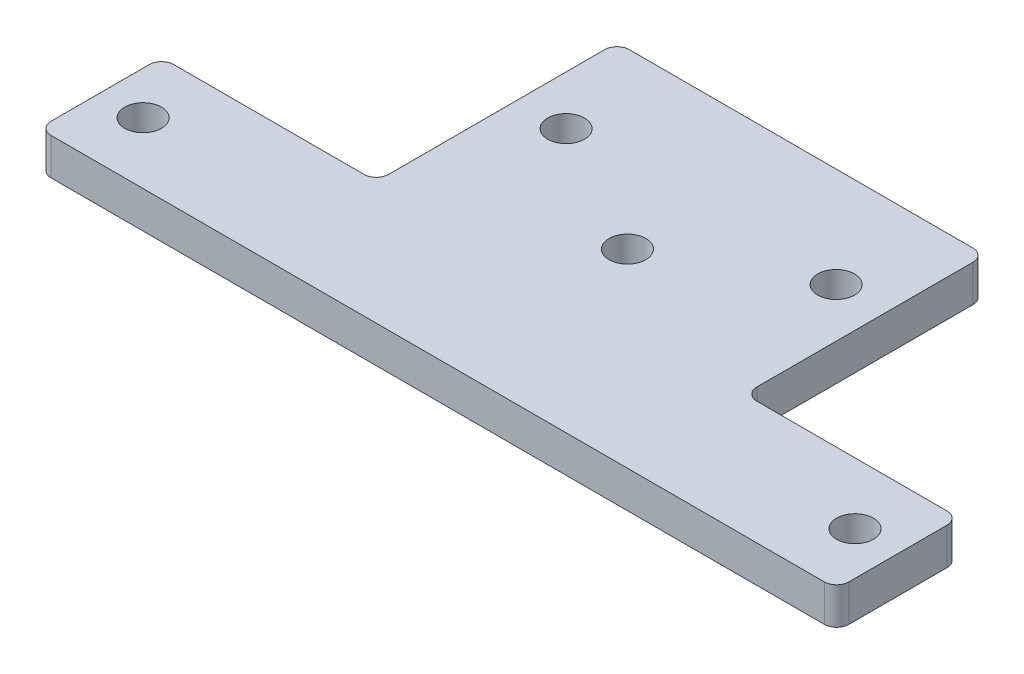
ISO-10303-21;
HEADER;
FILE_DESCRIPTION(('STEP AP214'),'2;1');
FILE_NAME('part.step','',(''),(''),'','','');
FILE_SCHEMA(('AUTOMOTIVE_DESIGN { 1 0 10303 214 1 1 1 1 }'));
ENDSEC;
DATA;
#1=APPLICATION_CONTEXT('core data for automotive mechanical design processes');
#2=APPLICATION_PROTOCOL_DEFINITION('international standard','automotive_design',2000,#1);
#3=PRODUCT_CONTEXT('',#1,'mechanical');
#4=PRODUCT('Part','Part','',(#3));
#5=PRODUCT_RELATED_PRODUCT_CATEGORY('part','',(#4));
#6=PRODUCT_DEFINITION_FORMATION('','',#4);
#7=PRODUCT_DEFINITION_CONTEXT('part definition',#1,'design');
#8=PRODUCT_DEFINITION('design','',#6,#7);
#9=PRODUCT_DEFINITION_SHAPE('','',#8);
#10=(LENGTH_UNIT() NAMED_UNIT(*) SI_UNIT(.MILLI.,.METRE.));
#11=(NAMED_UNIT(*) PLANE_ANGLE_UNIT() SI_UNIT($,.RADIAN.));
#12=(NAMED_UNIT(*) SI_UNIT($,.STERADIAN.) SOLID_ANGLE_UNIT());
#13=UNCERTAINTY_MEASURE_WITH_UNIT(LENGTH_MEASURE(1.E-05),#10,'distance_accuracy_value','');
#14=(GEOMETRIC_REPRESENTATION_CONTEXT(3) GLOBAL_UNCERTAINTY_ASSIGNED_CONTEXT((#13)) GLOBAL_UNIT_ASSIGNED_CONTEXT((#10,
#11,#12)) REPRESENTATION_CONTEXT('',''));
#15=CARTESIAN_POINT('',(0.,0.,0.));
#16=DIRECTION('',(0.,0.,1.));
#17=DIRECTION('',(1.,0.,0.));
#18=AXIS2_PLACEMENT_3D('',#15,#16,#17);
#19=CARTESIAN_POINT('',(0.,3.,0.));
#20=DIRECTION('',(0.,1.,0.));
#21=DIRECTION('',(0.,0.,1.));
#22=AXIS2_PLACEMENT_3D('',#19,#20,#21);
#23=PLANE('',#22);
#24=CARTESIAN_POINT('',(-10.6971721194879,3.,-6.38948645721603));
#25=DIRECTION('',(0.,1.,0.));
#26=DIRECTION('',(0.,0.,1.));
#27=AXIS2_PLACEMENT_3D('',#24,#25,#26);
#28=CIRCLE('',#27,1.5);
#29=CARTESIAN_POINT('',(-10.6971721194879,3.,-4.88948645721603));
#30=VERTEX_POINT('',#29);
#31=EDGE_CURVE('E302',#30,#30,#28,.T.);
#32=ORIENTED_EDGE('',*,*,#31,.F.);
#33=EDGE_LOOP('',(#32));
#34=FACE_BOUND('',#33,.T.);
#35=CARTESIAN_POINT('',(-28.6971721194879,3.,10.0723113204304));
#36=DIRECTION('',(0.,1.,0.));
#37=DIRECTION('',(0.,0.,-1.));
#38=AXIS2_PLACEMENT_3D('',#35,#36,#37);
#39=CIRCLE('',#38,1.5);
#40=CARTESIAN_POINT('',(-28.6971721194879,3.,8.57231132043043));
#41=VERTEX_POINT('',#40);
#42=EDGE_CURVE('E291',#41,#41,#39,.T.);
#43=ORIENTED_EDGE('',*,*,#42,.F.);
#44=EDGE_LOOP('',(#43));
#45=FACE_BOUND('',#44,.T.);
#46=DIRECTION('',(-1.,0.,0.));
#47=VECTOR('',#46,1.);
#48=CARTESIAN_POINT('',(-32.1971721194879,3.,5.07231132043044));
#49=LINE('',#48,#47);
#50=CARTESIAN_POINT('',(-15.6971721194879,3.,5.07231132043044));
#51=VERTEX_POINT('',#50);
#52=CARTESIAN_POINT('',(-31.1971721194879,3.,5.07231132043044));
#53=VERTEX_POINT('',#52);
#54=EDGE_CURVE('E167',#51,#53,#49,.T.);
#55=ORIENTED_EDGE('',*,*,#54,.T.);
#56=CARTESIAN_POINT('',(-31.1971721194879,3.,6.07231132043044));
#57=DIRECTION('',(0.,1.,0.));
#58=DIRECTION('',(0.,0.,1.));
#59=AXIS2_PLACEMENT_3D('',#56,#57,#58);
#60=CIRCLE('',#59,1.);
#61=CARTESIAN_POINT('',(-32.1971721194879,3.,6.07231132043044));
#62=VERTEX_POINT('',#61);
#63=EDGE_CURVE('E232',#53,#62,#60,.T.);
#64=ORIENTED_EDGE('',*,*,#63,.T.);
#65=DIRECTION('',(0.,0.,1.));
#66=VECTOR('',#65,1.);
#67=CARTESIAN_POINT('',(-32.1971721194879,3.,15.0723113204304));
#68=LINE('',#67,#66);
#69=CARTESIAN_POINT('',(-32.1971721194879,3.,14.0723113204304));
#70=VERTEX_POINT('',#69);
#71=EDGE_CURVE('E286',#62,#70,#68,.T.);
#72=ORIENTED_EDGE('',*,*,#71,.T.);
#73=CARTESIAN_POINT('',(-31.1971721194879,3.,14.0723113204304));
#74=DIRECTION('',(0.,1.,0.));
#75=DIRECTION('',(0.,0.,1.));
#76=AXIS2_PLACEMENT_3D('',#73,#74,#75);
#77=CIRCLE('',#76,1.);
#78=CARTESIAN_POINT('',(-31.1971721194879,3.,15.0723113204304));
#79=VERTEX_POINT('',#78);
#80=EDGE_CURVE('E230',#70,#79,#77,.T.);
#81=ORIENTED_EDGE('',*,*,#80,.T.);
#82=DIRECTION('',(1.,0.,0.));
#83=VECTOR('',#82,1.);
#84=CARTESIAN_POINT('',(-32.1971721194879,3.,15.0723113204304));
#85=LINE('',#84,#83);
#86=CARTESIAN_POINT('',(31.8028278805121,3.,15.0723113204304));
#87=VERTEX_POINT('',#86);
#88=EDGE_CURVE('E283',#79,#87,#85,.T.);
#89=ORIENTED_EDGE('',*,*,#88,.T.);
#90=CARTESIAN_POINT('',(31.8028278805121,3.,14.0723113204304));
#91=DIRECTION('',(0.,1.,0.));
#92=DIRECTION('',(0.,0.,1.));
#93=AXIS2_PLACEMENT_3D('',#90,#91,#92);
#94=CIRCLE('',#93,1.);
#95=CARTESIAN_POINT('',(32.8028278805121,3.,14.0723113204304));
#96=VERTEX_POINT('',#95);
#97=EDGE_CURVE('E228',#87,#96,#94,.T.);
#98=ORIENTED_EDGE('',*,*,#97,.T.);
#99=DIRECTION('',(0.,0.,-1.));
#100=VECTOR('',#99,1.);
#101=CARTESIAN_POINT('',(32.8028278805121,3.,15.0723113204304));
#102=LINE('',#101,#100);
#103=CARTESIAN_POINT('',(32.8028278805121,3.,6.07231132043044));
#104=VERTEX_POINT('',#103);
#105=EDGE_CURVE('E278',#96,#104,#102,.T.);
#106=ORIENTED_EDGE('',*,*,#105,.T.);
#107=CARTESIAN_POINT('',(31.8028278805121,3.,6.07231132043044));
#108=DIRECTION('',(0.,1.,0.));
#109=DIRECTION('',(0.,0.,1.));
#110=AXIS2_PLACEMENT_3D('',#107,#108,#109);
#111=CIRCLE('',#110,1.);
#112=CARTESIAN_POINT('',(31.8028278805121,3.,5.07231132043044));
#113=VERTEX_POINT('',#112);
#114=EDGE_CURVE('E226',#104,#113,#111,.T.);
#115=ORIENTED_EDGE('',*,*,#114,.T.);
#116=DIRECTION('',(-1.,0.,0.));
#117=VECTOR('',#116,1.);
#118=CARTESIAN_POINT('',(15.3028278805121,3.,5.07231132043043));
#119=LINE('',#118,#117);
#120=CARTESIAN_POINT('',(16.3028278805121,3.,5.07231132043043));
#121=VERTEX_POINT('',#120);
#122=EDGE_CURVE('E272',#113,#121,#119,.T.);
#123=ORIENTED_EDGE('',*,*,#122,.T.);
#124=CARTESIAN_POINT('',(16.3028278805121,3.,4.07231132043043));
#125=DIRECTION('',(0.,1.,0.));
#126=DIRECTION('',(0.,0.,1.));
#127=AXIS2_PLACEMENT_3D('',#124,#125,#126);
#128=CIRCLE('',#127,1.);
#129=CARTESIAN_POINT('',(15.3028278805121,3.,4.07231132043043));
#130=VERTEX_POINT('',#129);
#131=EDGE_CURVE('E11',#121,#130,#128,.F.);
#132=ORIENTED_EDGE('',*,*,#131,.T.);
#133=DIRECTION('',(0.,0.,-1.));
#134=VECTOR('',#133,1.);
#135=CARTESIAN_POINT('',(15.3028278805121,3.,-14.5370927334224));
#136=LINE('',#135,#134);
#137=CARTESIAN_POINT('',(15.3028278805121,3.,-13.5370927334224));
#138=VERTEX_POINT('',#137);
#139=EDGE_CURVE('E271',#130,#138,#136,.T.);
#140=ORIENTED_EDGE('',*,*,#139,.T.);
#141=CARTESIAN_POINT('',(14.3028278805121,3.,-13.5370927334224));
#142=DIRECTION('',(0.,1.,0.));
#143=DIRECTION('',(0.,0.,1.));
#144=AXIS2_PLACEMENT_3D('',#141,#142,#143);
#145=CIRCLE('',#144,1.);
#146=CARTESIAN_POINT('',(14.3028278805121,3.,-14.5370927334224));
#147=VERTEX_POINT('',#146);
#148=EDGE_CURVE('E55',#138,#147,#145,.T.);
#149=ORIENTED_EDGE('',*,*,#148,.T.);
#150=DIRECTION('',(-1.,0.,0.));
#151=VECTOR('',#150,1.);
#152=CARTESIAN_POINT('',(-14.6971721194879,3.,-14.5370927334224));
#153=LINE('',#152,#151);
#154=CARTESIAN_POINT('',(-13.6971721194879,3.,-14.5370927334224));
#155=VERTEX_POINT('',#154);
#156=EDGE_CURVE('E276',#147,#155,#153,.T.);
#157=ORIENTED_EDGE('',*,*,#156,.T.);
#158=CARTESIAN_POINT('',(-13.6971721194879,3.,-13.5370927334224));
#159=DIRECTION('',(0.,1.,0.));
#160=DIRECTION('',(0.,0.,1.));
#161=AXIS2_PLACEMENT_3D('',#158,#159,#160);
#162=CIRCLE('',#161,1.);
#163=CARTESIAN_POINT('',(-14.6971721194879,3.,-13.5370927334224));
#164=VERTEX_POINT('',#163);
#165=EDGE_CURVE('E223',#155,#164,#162,.T.);
#166=ORIENTED_EDGE('',*,*,#165,.T.);
#167=DIRECTION('',(0.,0.,1.));
#168=VECTOR('',#167,1.);
#169=CARTESIAN_POINT('',(-14.6971721194879,3.,5.07231132043044));
#170=LINE('',#169,#168);
#171=CARTESIAN_POINT('',(-14.6971721194879,3.,4.07231132043044));
#172=VERTEX_POINT('',#171);
#173=EDGE_CURVE('E185',#164,#172,#170,.T.);
#174=ORIENTED_EDGE('',*,*,#173,.T.);
#175=CARTESIAN_POINT('',(-15.6971721194879,3.,4.07231132043044));
#176=DIRECTION('',(0.,1.,0.));
#177=DIRECTION('',(0.,0.,1.));
#178=AXIS2_PLACEMENT_3D('',#175,#176,#177);
#179=CIRCLE('',#178,1.);
#180=EDGE_CURVE('E157',#172,#51,#179,.F.);
#181=ORIENTED_EDGE('',*,*,#180,.T.);
#182=EDGE_LOOP('',(#55,#64,#72,#81,#89,#98,#106,#115,#123,#132,#140,#149,#157,#166,#174,#181));
#183=FACE_BOUND('',#182,.T.);
#184=CARTESIAN_POINT('',(29.3028278805121,3.,10.0723113204304));
#185=DIRECTION('',(0.,1.,0.));
#186=DIRECTION('',(0.,0.,1.));
#187=AXIS2_PLACEMENT_3D('',#184,#185,#186);
#188=CIRCLE('',#187,1.5);
#189=CARTESIAN_POINT('',(29.3028278805121,3.,11.5723113204304));
#190=VERTEX_POINT('',#189);
#191=EDGE_CURVE('E176',#190,#190,#188,.T.);
#192=ORIENTED_EDGE('',*,*,#191,.F.);
#193=EDGE_LOOP('',(#192));
#194=FACE_BOUND('',#193,.T.);
#195=CARTESIAN_POINT('',(11.3028278805121,3.,-6.38948645721603));
#196=DIRECTION('',(0.,1.,0.));
#197=DIRECTION('',(0.,0.,-1.));
#198=AXIS2_PLACEMENT_3D('',#195,#196,#197);
#199=CIRCLE('',#198,1.5);
#200=CARTESIAN_POINT('',(11.3028278805121,3.,-7.88948645721603));
#201=VERTEX_POINT('',#200);
#202=EDGE_CURVE('E296',#201,#201,#199,.T.);
#203=ORIENTED_EDGE('',*,*,#202,.F.);
#204=EDGE_LOOP('',(#203));
#205=FACE_BOUND('',#204,.T.);
#206=CARTESIAN_POINT('',(0.302827880512113,3.,-0.389486457216035));
#207=DIRECTION('',(0.,1.,0.));
#208=DIRECTION('',(0.,0.,1.));
#209=AXIS2_PLACEMENT_3D('',#206,#207,#208);
#210=CIRCLE('',#209,1.5);
#211=CARTESIAN_POINT('',(0.302827880512113,3.,1.11051354278397));
#212=VERTEX_POINT('',#211);
#213=EDGE_CURVE('E308',#212,#212,#210,.T.);
#214=ORIENTED_EDGE('',*,*,#213,.F.);
#215=EDGE_LOOP('',(#214));
#216=FACE_BOUND('',#215,.T.);
#217=ADVANCED_FACE('F33',(#34,#45,#183,#194,#205,#216),#23,.T.);
#218=CARTESIAN_POINT('',(0.,0.,0.));
#219=DIRECTION('',(0.,1.,0.));
#220=DIRECTION('',(0.,0.,1.));
#221=AXIS2_PLACEMENT_3D('',#218,#219,#220);
#222=PLANE('',#221);
#223=DIRECTION('',(0.,0.,1.));
#224=VECTOR('',#223,1.);
#225=CARTESIAN_POINT('',(-32.1971721194879,0.,15.0723113204304));
#226=LINE('',#225,#224);
#227=CARTESIAN_POINT('',(-32.1971721194879,0.,6.07231132043044));
#228=VERTEX_POINT('',#227);
#229=CARTESIAN_POINT('',(-32.1971721194879,0.,14.0723113204304));
#230=VERTEX_POINT('',#229);
#231=EDGE_CURVE('E175',#228,#230,#226,.T.);
#232=ORIENTED_EDGE('',*,*,#231,.F.);
#233=CARTESIAN_POINT('',(-31.1971721194879,0.,6.07231132043044));
#234=DIRECTION('',(0.,1.,0.));
#235=DIRECTION('',(0.,0.,1.));
#236=AXIS2_PLACEMENT_3D('',#233,#234,#235);
#237=CIRCLE('',#236,1.);
#238=CARTESIAN_POINT('',(-31.1971721194879,0.,5.07231132043044));
#239=VERTEX_POINT('',#238);
#240=EDGE_CURVE('E174',#228,#239,#237,.F.);
#241=ORIENTED_EDGE('',*,*,#240,.T.);
#242=DIRECTION('',(-1.,0.,0.));
#243=VECTOR('',#242,1.);
#244=CARTESIAN_POINT('',(-32.1971721194879,0.,5.07231132043044));
#245=LINE('',#244,#243);
#246=CARTESIAN_POINT('',(-15.6971721194879,0.,5.07231132043044));
#247=VERTEX_POINT('',#246);
#248=EDGE_CURVE('E164',#247,#239,#245,.T.);
#249=ORIENTED_EDGE('',*,*,#248,.F.);
#250=CARTESIAN_POINT('',(-15.6971721194879,0.,4.07231132043044));
#251=DIRECTION('',(0.,1.,0.));
#252=DIRECTION('',(0.,0.,1.));
#253=AXIS2_PLACEMENT_3D('',#250,#251,#252);
#254=CIRCLE('',#253,1.);
#255=CARTESIAN_POINT('',(-14.6971721194879,0.,4.07231132043044));
#256=VERTEX_POINT('',#255);
#257=EDGE_CURVE('E147',#247,#256,#254,.T.);
#258=ORIENTED_EDGE('',*,*,#257,.T.);
#259=DIRECTION('',(0.,0.,1.));
#260=VECTOR('',#259,1.);
#261=CARTESIAN_POINT('',(-14.6971721194879,0.,5.07231132043044));
#262=LINE('',#261,#260);
#263=CARTESIAN_POINT('',(-14.6971721194879,0.,-13.5370927334224));
#264=VERTEX_POINT('',#263);
#265=EDGE_CURVE('E201',#264,#256,#262,.T.);
#266=ORIENTED_EDGE('',*,*,#265,.F.);
#267=CARTESIAN_POINT('',(-13.6971721194879,0.,-13.5370927334224));
#268=DIRECTION('',(0.,1.,0.));
#269=DIRECTION('',(0.,0.,1.));
#270=AXIS2_PLACEMENT_3D('',#267,#268,#269);
#271=CIRCLE('',#270,1.);
#272=CARTESIAN_POINT('',(-13.6971721194879,0.,-14.5370927334224));
#273=VERTEX_POINT('',#272);
#274=EDGE_CURVE('E212',#264,#273,#271,.F.);
#275=ORIENTED_EDGE('',*,*,#274,.T.);
#276=DIRECTION('',(-1.,0.,0.));
#277=VECTOR('',#276,1.);
#278=CARTESIAN_POINT('',(-14.6971721194879,0.,-14.5370927334224));
#279=LINE('',#278,#277);
#280=CARTESIAN_POINT('',(14.3028278805121,0.,-14.5370927334224));
#281=VERTEX_POINT('',#280);
#282=EDGE_CURVE('E199',#281,#273,#279,.T.);
#283=ORIENTED_EDGE('',*,*,#282,.F.);
#284=CARTESIAN_POINT('',(14.3028278805121,0.,-13.5370927334224));
#285=DIRECTION('',(0.,1.,0.));
#286=DIRECTION('',(0.,0.,1.));
#287=AXIS2_PLACEMENT_3D('',#284,#285,#286);
#288=CIRCLE('',#287,1.);
#289=CARTESIAN_POINT('',(15.3028278805121,0.,-13.5370927334224));
#290=VERTEX_POINT('',#289);
#291=EDGE_CURVE('E214',#281,#290,#288,.F.);
#292=ORIENTED_EDGE('',*,*,#291,.T.);
#293=DIRECTION('',(0.,0.,-1.));
#294=VECTOR('',#293,1.);
#295=CARTESIAN_POINT('',(15.3028278805121,0.,-14.5370927334224));
#296=LINE('',#295,#294);
#297=CARTESIAN_POINT('',(15.3028278805121,0.,4.07231132043043));
#298=VERTEX_POINT('',#297);
#299=EDGE_CURVE('E196',#298,#290,#296,.T.);
#300=ORIENTED_EDGE('',*,*,#299,.F.);
#301=CARTESIAN_POINT('',(16.3028278805121,0.,4.07231132043043));
#302=DIRECTION('',(0.,1.,0.));
#303=DIRECTION('',(0.,0.,1.));
#304=AXIS2_PLACEMENT_3D('',#301,#302,#303);
#305=CIRCLE('',#304,1.);
#306=CARTESIAN_POINT('',(16.3028278805121,0.,5.07231132043043));
#307=VERTEX_POINT('',#306);
#308=EDGE_CURVE('E41',#298,#307,#305,.T.);
#309=ORIENTED_EDGE('',*,*,#308,.T.);
#310=DIRECTION('',(-1.,0.,0.));
#311=VECTOR('',#310,1.);
#312=CARTESIAN_POINT('',(15.3028278805121,0.,5.07231132043043));
#313=LINE('',#312,#311);
#314=CARTESIAN_POINT('',(31.8028278805121,0.,5.07231132043044));
#315=VERTEX_POINT('',#314);
#316=EDGE_CURVE('E193',#315,#307,#313,.T.);
#317=ORIENTED_EDGE('',*,*,#316,.F.);
#318=CARTESIAN_POINT('',(31.8028278805121,0.,6.07231132043044));
#319=DIRECTION('',(0.,1.,0.));
#320=DIRECTION('',(0.,0.,1.));
#321=AXIS2_PLACEMENT_3D('',#318,#319,#320);
#322=CIRCLE('',#321,1.);
#323=CARTESIAN_POINT('',(32.8028278805121,0.,6.07231132043044));
#324=VERTEX_POINT('',#323);
#325=EDGE_CURVE('E216',#315,#324,#322,.F.);
#326=ORIENTED_EDGE('',*,*,#325,.T.);
#327=DIRECTION('',(0.,0.,-1.));
#328=VECTOR('',#327,1.);
#329=CARTESIAN_POINT('',(32.8028278805121,0.,15.0723113204304));
#330=LINE('',#329,#328);
#331=CARTESIAN_POINT('',(32.8028278805121,0.,14.0723113204304));
#332=VERTEX_POINT('',#331);
#333=EDGE_CURVE('E190',#332,#324,#330,.T.);
#334=ORIENTED_EDGE('',*,*,#333,.F.);
#335=CARTESIAN_POINT('',(31.8028278805121,0.,14.0723113204304));
#336=DIRECTION('',(0.,1.,0.));
#337=DIRECTION('',(0.,0.,1.));
#338=AXIS2_PLACEMENT_3D('',#335,#336,#337);
#339=CIRCLE('',#338,1.);
#340=CARTESIAN_POINT('',(31.8028278805121,0.,15.0723113204304));
#341=VERTEX_POINT('',#340);
#342=EDGE_CURVE('E218',#332,#341,#339,.F.);
#343=ORIENTED_EDGE('',*,*,#342,.T.);
#344=DIRECTION('',(1.,0.,0.));
#345=VECTOR('',#344,1.);
#346=CARTESIAN_POINT('',(-32.1971721194879,0.,15.0723113204304));
#347=LINE('',#346,#345);
#348=CARTESIAN_POINT('',(-31.1971721194879,0.,15.0723113204304));
#349=VERTEX_POINT('',#348);
#350=EDGE_CURVE('E179',#349,#341,#347,.T.);
#351=ORIENTED_EDGE('',*,*,#350,.F.);
#352=CARTESIAN_POINT('',(-31.1971721194879,0.,14.0723113204304));
#353=DIRECTION('',(0.,1.,0.));
#354=DIRECTION('',(0.,0.,1.));
#355=AXIS2_PLACEMENT_3D('',#352,#353,#354);
#356=CIRCLE('',#355,1.);
#357=EDGE_CURVE('E220',#349,#230,#356,.F.);
#358=ORIENTED_EDGE('',*,*,#357,.T.);
#359=EDGE_LOOP('',(#232,#241,#249,#258,#266,#275,#283,#292,#300,#309,#317,#326,#334,#343,#351,#358));
#360=FACE_BOUND('',#359,.T.);
#361=CARTESIAN_POINT('',(29.3028278805121,0.,10.0723113204304));
#362=DIRECTION('',(0.,1.,0.));
#363=DIRECTION('',(0.,0.,1.));
#364=AXIS2_PLACEMENT_3D('',#361,#362,#363);
#365=CIRCLE('',#364,1.5);
#366=CARTESIAN_POINT('',(29.3028278805121,0.,11.5723113204304));
#367=VERTEX_POINT('',#366);
#368=EDGE_CURVE('E182',#367,#367,#365,.T.);
#369=ORIENTED_EDGE('',*,*,#368,.T.);
#370=EDGE_LOOP('',(#369));
#371=FACE_BOUND('',#370,.T.);
#372=CARTESIAN_POINT('',(-28.6971721194879,0.,10.0723113204304));
#373=DIRECTION('',(0.,1.,0.));
#374=DIRECTION('',(0.,0.,-1.));
#375=AXIS2_PLACEMENT_3D('',#372,#373,#374);
#376=CIRCLE('',#375,1.5);
#377=CARTESIAN_POINT('',(-28.6971721194879,0.,8.57231132043043));
#378=VERTEX_POINT('',#377);
#379=EDGE_CURVE('E293',#378,#378,#376,.T.);
#380=ORIENTED_EDGE('',*,*,#379,.T.);
#381=EDGE_LOOP('',(#380));
#382=FACE_BOUND('',#381,.T.);
#383=CARTESIAN_POINT('',(11.3028278805121,0.,-6.38948645721603));
#384=DIRECTION('',(0.,1.,0.));
#385=DIRECTION('',(0.,0.,-1.));
#386=AXIS2_PLACEMENT_3D('',#383,#384,#385);
#387=CIRCLE('',#386,1.5);
#388=CARTESIAN_POINT('',(11.3028278805121,0.,-7.88948645721603));
#389=VERTEX_POINT('',#388);
#390=EDGE_CURVE('E299',#389,#389,#387,.T.);
#391=ORIENTED_EDGE('',*,*,#390,.T.);
#392=EDGE_LOOP('',(#391));
#393=FACE_BOUND('',#392,.T.);
#394=CARTESIAN_POINT('',(-10.6971721194879,0.,-6.38948645721603));
#395=DIRECTION('',(0.,1.,0.));
#396=DIRECTION('',(0.,0.,1.));
#397=AXIS2_PLACEMENT_3D('',#394,#395,#396);
#398=CIRCLE('',#397,1.5);
#399=CARTESIAN_POINT('',(-10.6971721194879,0.,-4.88948645721603));
#400=VERTEX_POINT('',#399);
#401=EDGE_CURVE('E305',#400,#400,#398,.T.);
#402=ORIENTED_EDGE('',*,*,#401,.T.);
#403=EDGE_LOOP('',(#402));
#404=FACE_BOUND('',#403,.T.);
#405=CARTESIAN_POINT('',(0.302827880512113,0.,-0.389486457216035));
#406=DIRECTION('',(0.,1.,0.));
#407=DIRECTION('',(0.,0.,1.));
#408=AXIS2_PLACEMENT_3D('',#405,#406,#407);
#409=CIRCLE('',#408,1.5);
#410=CARTESIAN_POINT('',(0.302827880512113,0.,1.11051354278397));
#411=VERTEX_POINT('',#410);
#412=EDGE_CURVE('E311',#411,#411,#409,.T.);
#413=ORIENTED_EDGE('',*,*,#412,.T.);
#414=EDGE_LOOP('',(#413));
#415=FACE_BOUND('',#414,.T.);
#416=ADVANCED_FACE('F172',(#360,#371,#382,#393,#404,#415),#222,.F.);
#417=CARTESIAN_POINT('',(-32.1971721194879,3.,5.07231132043044));
#418=DIRECTION('',(0.,0.,1.));
#419=DIRECTION('',(1.,0.,0.));
#420=AXIS2_PLACEMENT_3D('',#417,#418,#419);
#421=PLANE('',#420);
#422=ORIENTED_EDGE('',*,*,#54,.F.);
#423=DIRECTION('',(0.,-1.,0.));
#424=VECTOR('',#423,1.);
#425=CARTESIAN_POINT('',(-15.6971721194879,0.,5.07231132043044));
#426=LINE('',#425,#424);
#427=EDGE_CURVE('E151',#51,#247,#426,.T.);
#428=ORIENTED_EDGE('',*,*,#427,.T.);
#429=ORIENTED_EDGE('',*,*,#248,.T.);
#430=DIRECTION('',(0.,-1.,0.));
#431=VECTOR('',#430,1.);
#432=CARTESIAN_POINT('',(-31.1971721194879,3.,5.07231132043044));
#433=LINE('',#432,#431);
#434=EDGE_CURVE('E169',#239,#53,#433,.F.);
#435=ORIENTED_EDGE('',*,*,#434,.T.);
#436=EDGE_LOOP('',(#422,#428,#429,#435));
#437=FACE_BOUND('',#436,.T.);
#438=ADVANCED_FACE('F163',(#437),#421,.F.);
#439=CARTESIAN_POINT('',(-32.1971721194879,3.,15.0723113204304));
#440=DIRECTION('',(1.,0.,0.));
#441=DIRECTION('',(0.,0.,-1.));
#442=AXIS2_PLACEMENT_3D('',#439,#440,#441);
#443=PLANE('',#442);
#444=ORIENTED_EDGE('',*,*,#71,.F.);
#445=DIRECTION('',(0.,-1.,0.));
#446=VECTOR('',#445,1.);
#447=CARTESIAN_POINT('',(-32.1971721194879,3.,6.07231132043044));
#448=LINE('',#447,#446);
#449=EDGE_CURVE('E209',#62,#228,#448,.T.);
#450=ORIENTED_EDGE('',*,*,#449,.T.);
#451=ORIENTED_EDGE('',*,*,#231,.T.);
#452=DIRECTION('',(0.,-1.,0.));
#453=VECTOR('',#452,1.);
#454=CARTESIAN_POINT('',(-32.1971721194879,3.,14.0723113204304));
#455=LINE('',#454,#453);
#456=EDGE_CURVE('E207',#230,#70,#455,.F.);
#457=ORIENTED_EDGE('',*,*,#456,.T.);
#458=EDGE_LOOP('',(#444,#450,#451,#457));
#459=FACE_BOUND('',#458,.T.);
#460=ADVANCED_FACE('F351',(#459),#443,.F.);
#461=CARTESIAN_POINT('',(-32.1971721194879,3.,15.0723113204304));
#462=DIRECTION('',(0.,0.,-1.));
#463=DIRECTION('',(-1.,0.,0.));
#464=AXIS2_PLACEMENT_3D('',#461,#462,#463);
#465=PLANE('',#464);
#466=ORIENTED_EDGE('',*,*,#88,.F.);
#467=DIRECTION('',(0.,-1.,0.));
#468=VECTOR('',#467,1.);
#469=CARTESIAN_POINT('',(-31.1971721194879,3.,15.0723113204304));
#470=LINE('',#469,#468);
#471=EDGE_CURVE('E236',#79,#349,#470,.T.);
#472=ORIENTED_EDGE('',*,*,#471,.T.);
#473=ORIENTED_EDGE('',*,*,#350,.T.);
#474=DIRECTION('',(0.,-1.,0.));
#475=VECTOR('',#474,1.);
#476=CARTESIAN_POINT('',(31.8028278805121,3.,15.0723113204304));
#477=LINE('',#476,#475);
#478=EDGE_CURVE('E234',#341,#87,#477,.F.);
#479=ORIENTED_EDGE('',*,*,#478,.T.);
#480=EDGE_LOOP('',(#466,#472,#473,#479));
#481=FACE_BOUND('',#480,.T.);
#482=ADVANCED_FACE('F347',(#481),#465,.F.);
#483=CARTESIAN_POINT('',(32.8028278805121,3.,15.0723113204304));
#484=DIRECTION('',(-1.,0.,0.));
#485=DIRECTION('',(0.,0.,1.));
#486=AXIS2_PLACEMENT_3D('',#483,#484,#485);
#487=PLANE('',#486);
#488=ORIENTED_EDGE('',*,*,#105,.F.);
#489=DIRECTION('',(0.,-1.,0.));
#490=VECTOR('',#489,1.);
#491=CARTESIAN_POINT('',(32.8028278805121,3.,14.0723113204304));
#492=LINE('',#491,#490);
#493=EDGE_CURVE('E241',#96,#332,#492,.T.);
#494=ORIENTED_EDGE('',*,*,#493,.T.);
#495=ORIENTED_EDGE('',*,*,#333,.T.);
#496=DIRECTION('',(0.,-1.,0.));
#497=VECTOR('',#496,1.);
#498=CARTESIAN_POINT('',(32.8028278805121,3.,6.07231132043044));
#499=LINE('',#498,#497);
#500=EDGE_CURVE('E239',#324,#104,#499,.F.);
#501=ORIENTED_EDGE('',*,*,#500,.T.);
#502=EDGE_LOOP('',(#488,#494,#495,#501));
#503=FACE_BOUND('',#502,.T.);
#504=ADVANCED_FACE('F344',(#503),#487,.F.);
#505=CARTESIAN_POINT('',(15.3028278805121,3.,5.07231132043043));
#506=DIRECTION('',(0.,0.,1.));
#507=DIRECTION('',(1.,0.,0.));
#508=AXIS2_PLACEMENT_3D('',#505,#506,#507);
#509=PLANE('',#508);
#510=ORIENTED_EDGE('',*,*,#316,.T.);
#511=DIRECTION('',(0.,-1.,0.));
#512=VECTOR('',#511,1.);
#513=CARTESIAN_POINT('',(16.3028278805121,3.,5.07231132043043));
#514=LINE('',#513,#512);
#515=EDGE_CURVE('E252',#307,#121,#514,.F.);
#516=ORIENTED_EDGE('',*,*,#515,.T.);
#517=ORIENTED_EDGE('',*,*,#122,.F.);
#518=DIRECTION('',(0.,-1.,0.));
#519=VECTOR('',#518,1.);
#520=CARTESIAN_POINT('',(31.8028278805121,3.,5.07231132043044));
#521=LINE('',#520,#519);
#522=EDGE_CURVE('E249',#113,#315,#521,.T.);
#523=ORIENTED_EDGE('',*,*,#522,.T.);
#524=EDGE_LOOP('',(#510,#516,#517,#523));
#525=FACE_BOUND('',#524,.T.);
#526=ADVANCED_FACE('F263',(#525),#509,.F.);
#527=CARTESIAN_POINT('',(15.3028278805121,3.,-14.5370927334224));
#528=DIRECTION('',(-1.,0.,0.));
#529=DIRECTION('',(0.,0.,1.));
#530=AXIS2_PLACEMENT_3D('',#527,#528,#529);
#531=PLANE('',#530);
#532=ORIENTED_EDGE('',*,*,#139,.F.);
#533=DIRECTION('',(0.,-1.,0.));
#534=VECTOR('',#533,1.);
#535=CARTESIAN_POINT('',(15.3028278805121,0.,4.07231132043043));
#536=LINE('',#535,#534);
#537=EDGE_CURVE('E246',#130,#298,#536,.T.);
#538=ORIENTED_EDGE('',*,*,#537,.T.);
#539=ORIENTED_EDGE('',*,*,#299,.T.);
#540=DIRECTION('',(0.,-1.,0.));
#541=VECTOR('',#540,1.);
#542=CARTESIAN_POINT('',(15.3028278805121,3.,-13.5370927334224));
#543=LINE('',#542,#541);
#544=EDGE_CURVE('E244',#290,#138,#543,.F.);
#545=ORIENTED_EDGE('',*,*,#544,.T.);
#546=EDGE_LOOP('',(#532,#538,#539,#545));
#547=FACE_BOUND('',#546,.T.);
#548=ADVANCED_FACE('F274',(#547),#531,.F.);
#549=CARTESIAN_POINT('',(-14.6971721194879,3.,-14.5370927334224));
#550=DIRECTION('',(0.,0.,1.));
#551=DIRECTION('',(1.,0.,0.));
#552=AXIS2_PLACEMENT_3D('',#549,#550,#551);
#553=PLANE('',#552);
#554=ORIENTED_EDGE('',*,*,#156,.F.);
#555=DIRECTION('',(0.,-1.,0.));
#556=VECTOR('',#555,1.);
#557=CARTESIAN_POINT('',(14.3028278805121,3.,-14.5370927334224));
#558=LINE('',#557,#556);
#559=EDGE_CURVE('E158',#147,#281,#558,.T.);
#560=ORIENTED_EDGE('',*,*,#559,.T.);
#561=ORIENTED_EDGE('',*,*,#282,.T.);
#562=DIRECTION('',(0.,-1.,0.));
#563=VECTOR('',#562,1.);
#564=CARTESIAN_POINT('',(-13.6971721194879,3.,-14.5370927334224));
#565=LINE('',#564,#563);
#566=EDGE_CURVE('E48',#273,#155,#565,.F.);
#567=ORIENTED_EDGE('',*,*,#566,.T.);
#568=EDGE_LOOP('',(#554,#560,#561,#567));
#569=FACE_BOUND('',#568,.T.);
#570=ADVANCED_FACE('F336',(#569),#553,.F.);
#571=CARTESIAN_POINT('',(-14.6971721194879,3.,5.07231132043044));
#572=DIRECTION('',(1.,0.,0.));
#573=DIRECTION('',(0.,0.,-1.));
#574=AXIS2_PLACEMENT_3D('',#571,#572,#573);
#575=PLANE('',#574);
#576=ORIENTED_EDGE('',*,*,#265,.T.);
#577=DIRECTION('',(0.,-1.,0.));
#578=VECTOR('',#577,1.);
#579=CARTESIAN_POINT('',(-14.6971721194879,3.,4.07231132043044));
#580=LINE('',#579,#578);
#581=EDGE_CURVE('E152',#256,#172,#580,.F.);
#582=ORIENTED_EDGE('',*,*,#581,.T.);
#583=ORIENTED_EDGE('',*,*,#173,.F.);
#584=DIRECTION('',(0.,-1.,0.));
#585=VECTOR('',#584,1.);
#586=CARTESIAN_POINT('',(-14.6971721194879,3.,-13.5370927334224));
#587=LINE('',#586,#585);
#588=EDGE_CURVE('E168',#164,#264,#587,.T.);
#589=ORIENTED_EDGE('',*,*,#588,.T.);
#590=EDGE_LOOP('',(#576,#582,#583,#589));
#591=FACE_BOUND('',#590,.T.);
#592=ADVANCED_FACE('F333',(#591),#575,.F.);
#593=CARTESIAN_POINT('',(29.3028278805121,3.,10.0723113204304));
#594=DIRECTION('',(0.,-1.,0.));
#595=DIRECTION('',(0.,0.,-1.));
#596=AXIS2_PLACEMENT_3D('',#593,#594,#595);
#597=CYLINDRICAL_SURFACE('',#596,1.5);
#598=ORIENTED_EDGE('',*,*,#191,.T.);
#599=EDGE_LOOP('',(#598));
#600=FACE_BOUND('',#599,.T.);
#601=ORIENTED_EDGE('',*,*,#368,.F.);
#602=EDGE_LOOP('',(#601));
#603=FACE_BOUND('',#602,.T.);
#604=ADVANCED_FACE('F330',(#600,#603),#597,.F.);
#605=CARTESIAN_POINT('',(-28.6971721194879,3.,10.0723113204304));
#606=DIRECTION('',(0.,-1.,0.));
#607=DIRECTION('',(0.,0.,-1.));
#608=AXIS2_PLACEMENT_3D('',#605,#606,#607);
#609=CYLINDRICAL_SURFACE('',#608,1.5);
#610=ORIENTED_EDGE('',*,*,#42,.T.);
#611=EDGE_LOOP('',(#610));
#612=FACE_BOUND('',#611,.T.);
#613=ORIENTED_EDGE('',*,*,#379,.F.);
#614=EDGE_LOOP('',(#613));
#615=FACE_BOUND('',#614,.T.);
#616=ADVANCED_FACE('F535',(#612,#615),#609,.F.);
#617=CARTESIAN_POINT('',(11.3028278805121,3.,-6.38948645721603));
#618=DIRECTION('',(0.,-1.,0.));
#619=DIRECTION('',(0.,0.,-1.));
#620=AXIS2_PLACEMENT_3D('',#617,#618,#619);
#621=CYLINDRICAL_SURFACE('',#620,1.5);
#622=ORIENTED_EDGE('',*,*,#202,.T.);
#623=EDGE_LOOP('',(#622));
#624=FACE_BOUND('',#623,.T.);
#625=ORIENTED_EDGE('',*,*,#390,.F.);
#626=EDGE_LOOP('',(#625));
#627=FACE_BOUND('',#626,.T.);
#628=ADVANCED_FACE('F525',(#624,#627),#621,.F.);
#629=CARTESIAN_POINT('',(-10.6971721194879,3.,-6.38948645721603));
#630=DIRECTION('',(0.,-1.,0.));
#631=DIRECTION('',(0.,0.,-1.));
#632=AXIS2_PLACEMENT_3D('',#629,#630,#631);
#633=CYLINDRICAL_SURFACE('',#632,1.5);
#634=ORIENTED_EDGE('',*,*,#31,.T.);
#635=EDGE_LOOP('',(#634));
#636=FACE_BOUND('',#635,.T.);
#637=ORIENTED_EDGE('',*,*,#401,.F.);
#638=EDGE_LOOP('',(#637));
#639=FACE_BOUND('',#638,.T.);
#640=ADVANCED_FACE('F516',(#636,#639),#633,.F.);
#641=CARTESIAN_POINT('',(0.302827880512113,3.,-0.389486457216035));
#642=DIRECTION('',(0.,-1.,0.));
#643=DIRECTION('',(0.,0.,-1.));
#644=AXIS2_PLACEMENT_3D('',#641,#642,#643);
#645=CYLINDRICAL_SURFACE('',#644,1.5);
#646=ORIENTED_EDGE('',*,*,#213,.T.);
#647=EDGE_LOOP('',(#646));
#648=FACE_BOUND('',#647,.T.);
#649=ORIENTED_EDGE('',*,*,#412,.F.);
#650=EDGE_LOOP('',(#649));
#651=FACE_BOUND('',#650,.T.);
#652=ADVANCED_FACE('F317',(#648,#651),#645,.F.);
#653=CARTESIAN_POINT('',(-15.6971721194879,3.,4.07231132043044));
#654=DIRECTION('',(0.,1.,0.));
#655=DIRECTION('',(0.,0.,1.));
#656=AXIS2_PLACEMENT_3D('',#653,#654,#655);
#657=CYLINDRICAL_SURFACE('',#656,1.);
#658=ORIENTED_EDGE('',*,*,#180,.F.);
#659=ORIENTED_EDGE('',*,*,#581,.F.);
#660=ORIENTED_EDGE('',*,*,#257,.F.);
#661=ORIENTED_EDGE('',*,*,#427,.F.);
#662=EDGE_LOOP('',(#658,#659,#660,#661));
#663=FACE_BOUND('',#662,.T.);
#664=ADVANCED_FACE('F150',(#663),#657,.F.);
#665=CARTESIAN_POINT('',(-31.1971721194879,3.,6.07231132043044));
#666=DIRECTION('',(0.,-1.,0.));
#667=DIRECTION('',(0.,0.,-1.));
#668=AXIS2_PLACEMENT_3D('',#665,#666,#667);
#669=CYLINDRICAL_SURFACE('',#668,1.);
#670=ORIENTED_EDGE('',*,*,#63,.F.);
#671=ORIENTED_EDGE('',*,*,#434,.F.);
#672=ORIENTED_EDGE('',*,*,#240,.F.);
#673=ORIENTED_EDGE('',*,*,#449,.F.);
#674=EDGE_LOOP('',(#670,#671,#672,#673));
#675=FACE_BOUND('',#674,.T.);
#676=ADVANCED_FACE('F360',(#675),#669,.T.);
#677=CARTESIAN_POINT('',(-31.1971721194879,3.,14.0723113204304));
#678=DIRECTION('',(0.,-1.,0.));
#679=DIRECTION('',(0.,0.,-1.));
#680=AXIS2_PLACEMENT_3D('',#677,#678,#679);
#681=CYLINDRICAL_SURFACE('',#680,1.);
#682=ORIENTED_EDGE('',*,*,#80,.F.);
#683=ORIENTED_EDGE('',*,*,#456,.F.);
#684=ORIENTED_EDGE('',*,*,#357,.F.);
#685=ORIENTED_EDGE('',*,*,#471,.F.);
#686=EDGE_LOOP('',(#682,#683,#684,#685));
#687=FACE_BOUND('',#686,.T.);
#688=ADVANCED_FACE('F363',(#687),#681,.T.);
#689=CARTESIAN_POINT('',(31.8028278805121,3.,14.0723113204304));
#690=DIRECTION('',(0.,-1.,0.));
#691=DIRECTION('',(0.,0.,-1.));
#692=AXIS2_PLACEMENT_3D('',#689,#690,#691);
#693=CYLINDRICAL_SURFACE('',#692,1.);
#694=ORIENTED_EDGE('',*,*,#97,.F.);
#695=ORIENTED_EDGE('',*,*,#478,.F.);
#696=ORIENTED_EDGE('',*,*,#342,.F.);
#697=ORIENTED_EDGE('',*,*,#493,.F.);
#698=EDGE_LOOP('',(#694,#695,#696,#697));
#699=FACE_BOUND('',#698,.T.);
#700=ADVANCED_FACE('F367',(#699),#693,.T.);
#701=CARTESIAN_POINT('',(16.3028278805121,3.,4.07231132043043));
#702=DIRECTION('',(0.,1.,0.));
#703=DIRECTION('',(0.,0.,1.));
#704=AXIS2_PLACEMENT_3D('',#701,#702,#703);
#705=CYLINDRICAL_SURFACE('',#704,1.);
#706=ORIENTED_EDGE('',*,*,#131,.F.);
#707=ORIENTED_EDGE('',*,*,#515,.F.);
#708=ORIENTED_EDGE('',*,*,#308,.F.);
#709=ORIENTED_EDGE('',*,*,#537,.F.);
#710=EDGE_LOOP('',(#706,#707,#708,#709));
#711=FACE_BOUND('',#710,.T.);
#712=ADVANCED_FACE('F268',(#711),#705,.F.);
#713=CARTESIAN_POINT('',(31.8028278805121,3.,6.07231132043044));
#714=DIRECTION('',(0.,-1.,0.));
#715=DIRECTION('',(0.,0.,-1.));
#716=AXIS2_PLACEMENT_3D('',#713,#714,#715);
#717=CYLINDRICAL_SURFACE('',#716,1.);
#718=ORIENTED_EDGE('',*,*,#114,.F.);
#719=ORIENTED_EDGE('',*,*,#500,.F.);
#720=ORIENTED_EDGE('',*,*,#325,.F.);
#721=ORIENTED_EDGE('',*,*,#522,.F.);
#722=EDGE_LOOP('',(#718,#719,#720,#721));
#723=FACE_BOUND('',#722,.T.);
#724=ADVANCED_FACE('F374',(#723),#717,.T.);
#725=CARTESIAN_POINT('',(14.3028278805121,3.,-13.5370927334224));
#726=DIRECTION('',(0.,-1.,0.));
#727=DIRECTION('',(0.,0.,-1.));
#728=AXIS2_PLACEMENT_3D('',#725,#726,#727);
#729=CYLINDRICAL_SURFACE('',#728,1.);
#730=ORIENTED_EDGE('',*,*,#148,.F.);
#731=ORIENTED_EDGE('',*,*,#544,.F.);
#732=ORIENTED_EDGE('',*,*,#291,.F.);
#733=ORIENTED_EDGE('',*,*,#559,.F.);
#734=EDGE_LOOP('',(#730,#731,#732,#733));
#735=FACE_BOUND('',#734,.T.);
#736=ADVANCED_FACE('F376',(#735),#729,.T.);
#737=CARTESIAN_POINT('',(-13.6971721194879,3.,-13.5370927334224));
#738=DIRECTION('',(0.,-1.,0.));
#739=DIRECTION('',(0.,0.,-1.));
#740=AXIS2_PLACEMENT_3D('',#737,#738,#739);
#741=CYLINDRICAL_SURFACE('',#740,1.);
#742=ORIENTED_EDGE('',*,*,#165,.F.);
#743=ORIENTED_EDGE('',*,*,#566,.F.);
#744=ORIENTED_EDGE('',*,*,#274,.F.);
#745=ORIENTED_EDGE('',*,*,#588,.F.);
#746=EDGE_LOOP('',(#742,#743,#744,#745));
#747=FACE_BOUND('',#746,.T.);
#748=ADVANCED_FACE('F35',(#747),#741,.T.);
#749=CLOSED_SHELL('',(#217,#416,#438,#460,#482,#504,#526,#548,#570,#592,#604,#616,#628,#640,
#652,#664,#676,#688,#700,#712,#724,#736,#748));
#750=MANIFOLD_SOLID_BREP('B2',#749);
#751=ADVANCED_BREP_SHAPE_REPRESENTATION('',(#18,#750),#14);
#752=SHAPE_DEFINITION_REPRESENTATION(#9,#751);
ENDSEC;
END-ISO-10303-21;
